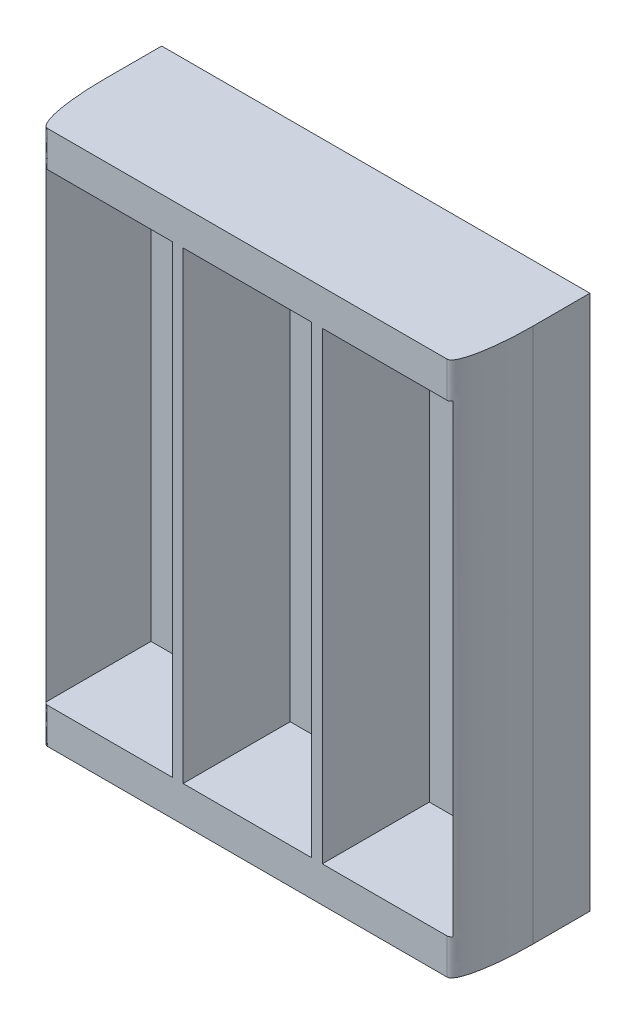
ISO-10303-21;
HEADER;
FILE_DESCRIPTION(('STEP AP214'),'2;1');
FILE_NAME('part.step','',(''),(''),'','','');
FILE_SCHEMA(('AUTOMOTIVE_DESIGN { 1 0 10303 214 1 1 1 1 }'));
ENDSEC;
DATA;
#1=APPLICATION_CONTEXT('core data for automotive mechanical design processes');
#2=APPLICATION_PROTOCOL_DEFINITION('international standard','automotive_design',2000,#1);
#3=PRODUCT_CONTEXT('',#1,'mechanical');
#4=PRODUCT('Part','Part','',(#3));
#5=PRODUCT_RELATED_PRODUCT_CATEGORY('part','',(#4));
#6=PRODUCT_DEFINITION_FORMATION('','',#4);
#7=PRODUCT_DEFINITION_CONTEXT('part definition',#1,'design');
#8=PRODUCT_DEFINITION('design','',#6,#7);
#9=PRODUCT_DEFINITION_SHAPE('','',#8);
#10=(LENGTH_UNIT() NAMED_UNIT(*) SI_UNIT(.MILLI.,.METRE.));
#11=(NAMED_UNIT(*) PLANE_ANGLE_UNIT() SI_UNIT($,.RADIAN.));
#12=(NAMED_UNIT(*) SI_UNIT($,.STERADIAN.) SOLID_ANGLE_UNIT());
#13=UNCERTAINTY_MEASURE_WITH_UNIT(LENGTH_MEASURE(1.E-05),#10,'distance_accuracy_value','');
#14=(GEOMETRIC_REPRESENTATION_CONTEXT(3) GLOBAL_UNCERTAINTY_ASSIGNED_CONTEXT((#13)) GLOBAL_UNIT_ASSIGNED_CONTEXT((#10,
#11,#12)) REPRESENTATION_CONTEXT('',''));
#15=CARTESIAN_POINT('',(0.,0.,0.));
#16=DIRECTION('',(0.,0.,1.));
#17=DIRECTION('',(1.,0.,0.));
#18=AXIS2_PLACEMENT_3D('',#15,#16,#17);
#19=CARTESIAN_POINT('',(30.,75.,18.));
#20=DIRECTION('',(-1.,0.,0.));
#21=DIRECTION('',(0.,0.,1.));
#22=AXIS2_PLACEMENT_3D('',#19,#20,#21);
#23=PLANE('',#22);
#24=DIRECTION('',(0.,0.,-1.));
#25=VECTOR('',#24,1.);
#26=CARTESIAN_POINT('',(30.,75.,18.));
#27=LINE('',#26,#25);
#28=CARTESIAN_POINT('',(30.,75.,7.99999999999999));
#29=VERTEX_POINT('',#28);
#30=CARTESIAN_POINT('',(30.,75.,0.));
#31=VERTEX_POINT('',#30);
#32=EDGE_CURVE('E344',#29,#31,#27,.T.);
#33=ORIENTED_EDGE('',*,*,#32,.F.);
#34=CARTESIAN_POINT('',(30.,-3.75000000000002,7.99999999999999));
#35=CARTESIAN_POINT('',(30.,23.75,7.99999999999999));
#36=CARTESIAN_POINT('',(30.,51.25,7.99999999999999));
#37=CARTESIAN_POINT('',(30.,78.75,7.99999999999999));
#38=(BOUNDED_CURVE() B_SPLINE_CURVE(3,(#34,#35,#36,#37),.UNSPECIFIED.,.F.,
.F.) B_SPLINE_CURVE_WITH_KNOTS((4,4),(-0.00375,0.07875),
.UNSPECIFIED.) CURVE() GEOMETRIC_REPRESENTATION_ITEM() RATIONAL_B_SPLINE_CURVE((1.,1.,1.,1.)) REPRESENTATION_ITEM(''));
#39=CARTESIAN_POINT('',(30.,0.,7.99999999999999));
#40=VERTEX_POINT('',#39);
#41=EDGE_CURVE('E361',#29,#40,#38,.F.);
#42=ORIENTED_EDGE('',*,*,#41,.T.);
#43=DIRECTION('',(0.,0.,-1.));
#44=VECTOR('',#43,1.);
#45=CARTESIAN_POINT('',(30.,0.,18.));
#46=LINE('',#45,#44);
#47=CARTESIAN_POINT('',(30.,0.,0.));
#48=VERTEX_POINT('',#47);
#49=EDGE_CURVE('E252',#40,#48,#46,.T.);
#50=ORIENTED_EDGE('',*,*,#49,.T.);
#51=DIRECTION('',(0.,-1.,0.));
#52=VECTOR('',#51,1.);
#53=CARTESIAN_POINT('',(30.,75.,0.));
#54=LINE('',#53,#52);
#55=EDGE_CURVE('E356',#31,#48,#54,.T.);
#56=ORIENTED_EDGE('',*,*,#55,.F.);
#57=EDGE_LOOP('',(#33,#42,#50,#56));
#58=FACE_BOUND('',#57,.T.);
#59=ADVANCED_FACE('F48',(#58),#23,.F.);
#60=CARTESIAN_POINT('',(-30.,75.,0.));
#61=DIRECTION('',(0.,0.,1.));
#62=DIRECTION('',(1.,0.,0.));
#63=AXIS2_PLACEMENT_3D('',#60,#61,#62);
#64=PLANE('',#63);
#65=DIRECTION('',(-1.,0.,0.));
#66=VECTOR('',#65,1.);
#67=CARTESIAN_POINT('',(-30.,0.,0.));
#68=LINE('',#67,#66);
#69=CARTESIAN_POINT('',(-30.,0.,0.));
#70=VERTEX_POINT('',#69);
#71=EDGE_CURVE('E364',#48,#70,#68,.T.);
#72=ORIENTED_EDGE('',*,*,#71,.T.);
#73=DIRECTION('',(0.,-1.,0.));
#74=VECTOR('',#73,1.);
#75=CARTESIAN_POINT('',(-30.,75.,0.));
#76=LINE('',#75,#74);
#77=CARTESIAN_POINT('',(-30.,75.,0.));
#78=VERTEX_POINT('',#77);
#79=EDGE_CURVE('E352',#78,#70,#76,.T.);
#80=ORIENTED_EDGE('',*,*,#79,.F.);
#81=DIRECTION('',(-1.,0.,0.));
#82=VECTOR('',#81,1.);
#83=CARTESIAN_POINT('',(-30.,75.,0.));
#84=LINE('',#83,#82);
#85=EDGE_CURVE('E704',#31,#78,#84,.T.);
#86=ORIENTED_EDGE('',*,*,#85,.F.);
#87=ORIENTED_EDGE('',*,*,#55,.T.);
#88=EDGE_LOOP('',(#72,#80,#86,#87));
#89=FACE_BOUND('',#88,.T.);
#90=ADVANCED_FACE('F314',(#89),#64,.F.);
#91=CARTESIAN_POINT('',(-30.,75.,0.));
#92=DIRECTION('',(1.,0.,0.));
#93=DIRECTION('',(0.,0.,-1.));
#94=AXIS2_PLACEMENT_3D('',#91,#92,#93);
#95=PLANE('',#94);
#96=DIRECTION('',(0.,0.,1.));
#97=VECTOR('',#96,1.);
#98=CARTESIAN_POINT('',(-30.,0.,0.));
#99=LINE('',#98,#97);
#100=CARTESIAN_POINT('',(-30.,0.,8.));
#101=VERTEX_POINT('',#100);
#102=EDGE_CURVE('E345',#70,#101,#99,.T.);
#103=ORIENTED_EDGE('',*,*,#102,.T.);
#104=CARTESIAN_POINT('',(-30.,78.75,8.));
#105=CARTESIAN_POINT('',(-30.,51.25,8.));
#106=CARTESIAN_POINT('',(-30.,23.75,8.));
#107=CARTESIAN_POINT('',(-30.,-3.75000000000002,8.));
#108=(BOUNDED_CURVE() B_SPLINE_CURVE(3,(#104,#105,#106,#107),.UNSPECIFIED.,.F.,
.F.) B_SPLINE_CURVE_WITH_KNOTS((4,4),(-0.00375,0.07875),
.UNSPECIFIED.) CURVE() GEOMETRIC_REPRESENTATION_ITEM() RATIONAL_B_SPLINE_CURVE((1.,1.,1.,1.)) REPRESENTATION_ITEM(''));
#109=CARTESIAN_POINT('',(-30.,75.,8.));
#110=VERTEX_POINT('',#109);
#111=EDGE_CURVE('E12',#101,#110,#108,.F.);
#112=ORIENTED_EDGE('',*,*,#111,.T.);
#113=DIRECTION('',(0.,0.,1.));
#114=VECTOR('',#113,1.);
#115=CARTESIAN_POINT('',(-30.,75.,0.));
#116=LINE('',#115,#114);
#117=EDGE_CURVE('E670',#78,#110,#116,.T.);
#118=ORIENTED_EDGE('',*,*,#117,.F.);
#119=ORIENTED_EDGE('',*,*,#79,.T.);
#120=EDGE_LOOP('',(#103,#112,#118,#119));
#121=FACE_BOUND('',#120,.T.);
#122=ADVANCED_FACE('F303',(#121),#95,.F.);
#123=CARTESIAN_POINT('',(-30.,75.,18.));
#124=DIRECTION('',(0.,0.,-1.));
#125=DIRECTION('',(-1.,0.,0.));
#126=AXIS2_PLACEMENT_3D('',#123,#124,#125);
#127=PLANE('',#126);
#128=DIRECTION('',(0.,-1.,0.));
#129=VECTOR('',#128,1.);
#130=CARTESIAN_POINT('',(-8.99999999999999,70.,18.));
#131=LINE('',#130,#129);
#132=CARTESIAN_POINT('',(-8.99999999999999,70.,18.));
#133=VERTEX_POINT('',#132);
#134=CARTESIAN_POINT('',(-8.99999999999999,5.,18.));
#135=VERTEX_POINT('',#134);
#136=EDGE_CURVE('E579',#133,#135,#131,.T.);
#137=ORIENTED_EDGE('',*,*,#136,.F.);
#138=DIRECTION('',(-1.,0.,0.));
#139=VECTOR('',#138,1.);
#140=CARTESIAN_POINT('',(-8.99999999999999,70.,18.));
#141=LINE('',#140,#139);
#142=CARTESIAN_POINT('',(9.00000000000001,70.,18.));
#143=VERTEX_POINT('',#142);
#144=EDGE_CURVE('E233',#143,#133,#141,.T.);
#145=ORIENTED_EDGE('',*,*,#144,.F.);
#146=DIRECTION('',(0.,1.,0.));
#147=VECTOR('',#146,1.);
#148=CARTESIAN_POINT('',(9.00000000000001,70.,18.));
#149=LINE('',#148,#147);
#150=CARTESIAN_POINT('',(9.00000000000001,5.,18.));
#151=VERTEX_POINT('',#150);
#152=EDGE_CURVE('E587',#151,#143,#149,.T.);
#153=ORIENTED_EDGE('',*,*,#152,.F.);
#154=DIRECTION('',(1.,0.,0.));
#155=VECTOR('',#154,1.);
#156=CARTESIAN_POINT('',(-8.99999999999999,5.,18.));
#157=LINE('',#156,#155);
#158=EDGE_CURVE('E583',#135,#151,#157,.T.);
#159=ORIENTED_EDGE('',*,*,#158,.F.);
#160=EDGE_LOOP('',(#137,#145,#153,#159));
#161=FACE_BOUND('',#160,.T.);
#162=DIRECTION('',(1.,0.,0.));
#163=VECTOR('',#162,1.);
#164=CARTESIAN_POINT('',(-30.,0.,18.));
#165=LINE('',#164,#163);
#166=CARTESIAN_POINT('',(-28.,0.,18.));
#167=VERTEX_POINT('',#166);
#168=CARTESIAN_POINT('',(28.,0.,18.));
#169=VERTEX_POINT('',#168);
#170=EDGE_CURVE('E334',#167,#169,#165,.T.);
#171=ORIENTED_EDGE('',*,*,#170,.T.);
#172=CARTESIAN_POINT('',(28.,78.75,18.));
#173=CARTESIAN_POINT('',(28.,51.25,18.));
#174=CARTESIAN_POINT('',(28.,23.75,18.));
#175=CARTESIAN_POINT('',(28.,-3.75000000000002,18.));
#176=(BOUNDED_CURVE() B_SPLINE_CURVE(3,(#172,#173,#174,#175),.UNSPECIFIED.,.F.,
.F.) B_SPLINE_CURVE_WITH_KNOTS((4,4),(-0.00375,0.07875),
.UNSPECIFIED.) CURVE() GEOMETRIC_REPRESENTATION_ITEM() RATIONAL_B_SPLINE_CURVE((1.,1.,1.,1.)) REPRESENTATION_ITEM(''));
#177=CARTESIAN_POINT('',(28.,5.,18.));
#178=VERTEX_POINT('',#177);
#179=EDGE_CURVE('E462',#169,#178,#176,.F.);
#180=ORIENTED_EDGE('',*,*,#179,.T.);
#181=DIRECTION('',(1.,0.,0.));
#182=VECTOR('',#181,1.);
#183=CARTESIAN_POINT('',(10.5,5.,18.));
#184=LINE('',#183,#182);
#185=CARTESIAN_POINT('',(10.5,5.,18.));
#186=VERTEX_POINT('',#185);
#187=EDGE_CURVE('E625',#186,#178,#184,.T.);
#188=ORIENTED_EDGE('',*,*,#187,.F.);
#189=DIRECTION('',(0.,-1.,0.));
#190=VECTOR('',#189,1.);
#191=CARTESIAN_POINT('',(10.5,70.,18.));
#192=LINE('',#191,#190);
#193=CARTESIAN_POINT('',(10.5,70.,18.));
#194=VERTEX_POINT('',#193);
#195=EDGE_CURVE('E622',#194,#186,#192,.T.);
#196=ORIENTED_EDGE('',*,*,#195,.F.);
#197=DIRECTION('',(-1.,0.,0.));
#198=VECTOR('',#197,1.);
#199=CARTESIAN_POINT('',(10.5,70.,18.));
#200=LINE('',#199,#198);
#201=CARTESIAN_POINT('',(28.,70.,18.));
#202=VERTEX_POINT('',#201);
#203=EDGE_CURVE('E239',#202,#194,#200,.T.);
#204=ORIENTED_EDGE('',*,*,#203,.F.);
#205=CARTESIAN_POINT('',(28.,78.75,18.));
#206=CARTESIAN_POINT('',(28.,51.25,18.));
#207=CARTESIAN_POINT('',(28.,23.75,18.));
#208=CARTESIAN_POINT('',(28.,-3.75000000000002,18.));
#209=(BOUNDED_CURVE() B_SPLINE_CURVE(3,(#205,#206,#207,#208),.UNSPECIFIED.,.F.,
.F.) B_SPLINE_CURVE_WITH_KNOTS((4,4),(-0.00375,0.07875),
.UNSPECIFIED.) CURVE() GEOMETRIC_REPRESENTATION_ITEM() RATIONAL_B_SPLINE_CURVE((1.,1.,1.,1.)) REPRESENTATION_ITEM(''));
#210=CARTESIAN_POINT('',(28.,75.,18.));
#211=VERTEX_POINT('',#210);
#212=EDGE_CURVE('E506',#202,#211,#209,.F.);
#213=ORIENTED_EDGE('',*,*,#212,.T.);
#214=DIRECTION('',(1.,0.,0.));
#215=VECTOR('',#214,1.);
#216=CARTESIAN_POINT('',(-30.,75.,18.));
#217=LINE('',#216,#215);
#218=CARTESIAN_POINT('',(-28.,75.,18.));
#219=VERTEX_POINT('',#218);
#220=EDGE_CURVE('E357',#219,#211,#217,.T.);
#221=ORIENTED_EDGE('',*,*,#220,.F.);
#222=CARTESIAN_POINT('',(-28.,-3.75000000000002,18.));
#223=CARTESIAN_POINT('',(-28.,23.75,18.));
#224=CARTESIAN_POINT('',(-28.,51.25,18.));
#225=CARTESIAN_POINT('',(-28.,78.75,18.));
#226=(BOUNDED_CURVE() B_SPLINE_CURVE(3,(#222,#223,#224,#225),.UNSPECIFIED.,.F.,
.F.) B_SPLINE_CURVE_WITH_KNOTS((4,4),(-0.00375,0.07875),
.UNSPECIFIED.) CURVE() GEOMETRIC_REPRESENTATION_ITEM() RATIONAL_B_SPLINE_CURVE((1.,1.,1.,1.)) REPRESENTATION_ITEM(''));
#227=CARTESIAN_POINT('',(-28.,70.,18.));
#228=VERTEX_POINT('',#227);
#229=EDGE_CURVE('E404',#219,#228,#226,.F.);
#230=ORIENTED_EDGE('',*,*,#229,.T.);
#231=DIRECTION('',(-1.,0.,0.));
#232=VECTOR('',#231,1.);
#233=CARTESIAN_POINT('',(-28.5,70.,18.));
#234=LINE('',#233,#232);
#235=CARTESIAN_POINT('',(-10.5,70.,18.));
#236=VERTEX_POINT('',#235);
#237=EDGE_CURVE('E216',#236,#228,#234,.T.);
#238=ORIENTED_EDGE('',*,*,#237,.F.);
#239=DIRECTION('',(0.,1.,0.));
#240=VECTOR('',#239,1.);
#241=CARTESIAN_POINT('',(-10.5,70.,18.));
#242=LINE('',#241,#240);
#243=CARTESIAN_POINT('',(-10.5,5.,18.));
#244=VERTEX_POINT('',#243);
#245=EDGE_CURVE('E219',#244,#236,#242,.T.);
#246=ORIENTED_EDGE('',*,*,#245,.F.);
#247=DIRECTION('',(1.,0.,0.));
#248=VECTOR('',#247,1.);
#249=CARTESIAN_POINT('',(-28.5,5.,18.));
#250=LINE('',#249,#248);
#251=CARTESIAN_POINT('',(-28.,5.,18.));
#252=VERTEX_POINT('',#251);
#253=EDGE_CURVE('E230',#252,#244,#250,.T.);
#254=ORIENTED_EDGE('',*,*,#253,.F.);
#255=CARTESIAN_POINT('',(-28.,-3.75000000000002,18.));
#256=CARTESIAN_POINT('',(-28.,23.75,18.));
#257=CARTESIAN_POINT('',(-28.,51.25,18.));
#258=CARTESIAN_POINT('',(-28.,78.75,18.));
#259=(BOUNDED_CURVE() B_SPLINE_CURVE(3,(#255,#256,#257,#258),.UNSPECIFIED.,.F.,
.F.) B_SPLINE_CURVE_WITH_KNOTS((4,4),(-0.00375,0.07875),
.UNSPECIFIED.) CURVE() GEOMETRIC_REPRESENTATION_ITEM() RATIONAL_B_SPLINE_CURVE((1.,1.,1.,1.)) REPRESENTATION_ITEM(''));
#260=EDGE_CURVE('E441',#252,#167,#259,.F.);
#261=ORIENTED_EDGE('',*,*,#260,.T.);
#262=EDGE_LOOP('',(#171,#180,#188,#196,#204,#213,#221,#230,#238,#246,#254,#261));
#263=FACE_BOUND('',#262,.T.);
#264=ADVANCED_FACE('F313',(#161,#263),#127,.F.);
#265=CARTESIAN_POINT('',(0.,75.,0.));
#266=DIRECTION('',(0.,-1.,0.));
#267=DIRECTION('',(0.,0.,-1.));
#268=AXIS2_PLACEMENT_3D('',#265,#266,#267);
#269=PLANE('',#268);
#270=ORIENTED_EDGE('',*,*,#220,.T.);
#271=CARTESIAN_POINT('',(30.,75.,7.99999999999999));
#272=CARTESIAN_POINT('',(30.,75.,18.));
#273=CARTESIAN_POINT('',(28.,75.,18.));
#274=(BOUNDED_CURVE() B_SPLINE_CURVE(2,(#271,#272,#273),.UNSPECIFIED.,.F.,
.F.) B_SPLINE_CURVE_WITH_KNOTS((3,3),(0.,1.),
.UNSPECIFIED.) CURVE() GEOMETRIC_REPRESENTATION_ITEM() RATIONAL_B_SPLINE_CURVE((1.,
0.707106781186548,1.)) REPRESENTATION_ITEM(''));
#275=EDGE_CURVE('E517',#211,#29,#274,.F.);
#276=ORIENTED_EDGE('',*,*,#275,.T.);
#277=ORIENTED_EDGE('',*,*,#32,.T.);
#278=ORIENTED_EDGE('',*,*,#85,.T.);
#279=ORIENTED_EDGE('',*,*,#117,.T.);
#280=CARTESIAN_POINT('',(-28.,75.,18.));
#281=CARTESIAN_POINT('',(-30.,75.,18.));
#282=CARTESIAN_POINT('',(-30.,75.,8.));
#283=(BOUNDED_CURVE() B_SPLINE_CURVE(2,(#280,#281,#282),.UNSPECIFIED.,.F.,
.F.) B_SPLINE_CURVE_WITH_KNOTS((3,3),(0.,1.),
.UNSPECIFIED.) CURVE() GEOMETRIC_REPRESENTATION_ITEM() RATIONAL_B_SPLINE_CURVE((1.,
0.707106781186547,1.)) REPRESENTATION_ITEM(''));
#284=EDGE_CURVE('E383',#110,#219,#283,.F.);
#285=ORIENTED_EDGE('',*,*,#284,.T.);
#286=EDGE_LOOP('',(#270,#276,#277,#278,#279,#285));
#287=FACE_BOUND('',#286,.T.);
#288=ADVANCED_FACE('F718',(#287),#269,.F.);
#289=CARTESIAN_POINT('',(0.,0.,0.));
#290=DIRECTION('',(0.,-1.,0.));
#291=DIRECTION('',(0.,0.,-1.));
#292=AXIS2_PLACEMENT_3D('',#289,#290,#291);
#293=PLANE('',#292);
#294=ORIENTED_EDGE('',*,*,#49,.F.);
#295=CARTESIAN_POINT('',(28.,0.,18.));
#296=CARTESIAN_POINT('',(30.,0.,18.));
#297=CARTESIAN_POINT('',(30.,0.,7.99999999999999));
#298=(BOUNDED_CURVE() B_SPLINE_CURVE(2,(#295,#296,#297),.UNSPECIFIED.,.F.,
.F.) B_SPLINE_CURVE_WITH_KNOTS((3,3),(0.,1.),
.UNSPECIFIED.) CURVE() GEOMETRIC_REPRESENTATION_ITEM() RATIONAL_B_SPLINE_CURVE((1.,
0.707106781186548,1.)) REPRESENTATION_ITEM(''));
#299=EDGE_CURVE('E533',#40,#169,#298,.F.);
#300=ORIENTED_EDGE('',*,*,#299,.T.);
#301=ORIENTED_EDGE('',*,*,#170,.F.);
#302=CARTESIAN_POINT('',(-30.,0.,8.));
#303=CARTESIAN_POINT('',(-30.,0.,18.));
#304=CARTESIAN_POINT('',(-28.,0.,18.));
#305=(BOUNDED_CURVE() B_SPLINE_CURVE(2,(#302,#303,#304),.UNSPECIFIED.,.F.,
.F.) B_SPLINE_CURVE_WITH_KNOTS((3,3),(0.,1.),
.UNSPECIFIED.) CURVE() GEOMETRIC_REPRESENTATION_ITEM() RATIONAL_B_SPLINE_CURVE((1.,
0.707106781186548,1.)) REPRESENTATION_ITEM(''));
#306=EDGE_CURVE('E380',#167,#101,#305,.F.);
#307=ORIENTED_EDGE('',*,*,#306,.T.);
#308=ORIENTED_EDGE('',*,*,#102,.F.);
#309=ORIENTED_EDGE('',*,*,#71,.F.);
#310=EDGE_LOOP('',(#294,#300,#301,#307,#308,#309));
#311=FACE_BOUND('',#310,.T.);
#312=ADVANCED_FACE('F727',(#311),#293,.T.);
#313=CARTESIAN_POINT('',(10.5,70.,3.));
#314=DIRECTION('',(0.,1.,0.));
#315=DIRECTION('',(0.,0.,1.));
#316=AXIS2_PLACEMENT_3D('',#313,#314,#315);
#317=PLANE('',#316);
#318=DIRECTION('',(0.,0.,1.));
#319=VECTOR('',#318,1.);
#320=CARTESIAN_POINT('',(28.5,70.,3.));
#321=LINE('',#320,#319);
#322=CARTESIAN_POINT('',(28.5,70.,3.));
#323=VERTEX_POINT('',#322);
#324=CARTESIAN_POINT('',(28.5,70.,17.6824583655119));
#325=VERTEX_POINT('',#324);
#326=EDGE_CURVE('E653',#323,#325,#321,.T.);
#327=ORIENTED_EDGE('',*,*,#326,.T.);
#328=CARTESIAN_POINT('',(28.,70.,18.));
#329=CARTESIAN_POINT('',(30.,70.,18.));
#330=CARTESIAN_POINT('',(30.,70.,7.99999999999999));
#331=(BOUNDED_CURVE() B_SPLINE_CURVE(2,(#328,#329,#330),.UNSPECIFIED.,.F.,
.F.) B_SPLINE_CURVE_WITH_KNOTS((3,3),(0.,1.),
.UNSPECIFIED.) CURVE() GEOMETRIC_REPRESENTATION_ITEM() RATIONAL_B_SPLINE_CURVE((1.,
0.707106781186548,1.)) REPRESENTATION_ITEM(''));
#332=EDGE_CURVE('E495',#325,#202,#331,.F.);
#333=ORIENTED_EDGE('',*,*,#332,.T.);
#334=ORIENTED_EDGE('',*,*,#203,.T.);
#335=DIRECTION('',(0.,0.,1.));
#336=VECTOR('',#335,1.);
#337=CARTESIAN_POINT('',(10.5,70.,3.));
#338=LINE('',#337,#336);
#339=CARTESIAN_POINT('',(10.5,70.,3.));
#340=VERTEX_POINT('',#339);
#341=EDGE_CURVE('E643',#340,#194,#338,.T.);
#342=ORIENTED_EDGE('',*,*,#341,.F.);
#343=DIRECTION('',(-1.,0.,0.));
#344=VECTOR('',#343,1.);
#345=CARTESIAN_POINT('',(10.5,70.,3.));
#346=LINE('',#345,#344);
#347=EDGE_CURVE('E628',#323,#340,#346,.T.);
#348=ORIENTED_EDGE('',*,*,#347,.F.);
#349=EDGE_LOOP('',(#327,#333,#334,#342,#348));
#350=FACE_BOUND('',#349,.T.);
#351=ADVANCED_FACE('F733',(#350),#317,.F.);
#352=CARTESIAN_POINT('',(28.5,70.,3.));
#353=DIRECTION('',(1.,0.,0.));
#354=DIRECTION('',(0.,1.,0.));
#355=AXIS2_PLACEMENT_3D('',#352,#353,#354);
#356=PLANE('',#355);
#357=DIRECTION('',(0.,0.,1.));
#358=VECTOR('',#357,1.);
#359=CARTESIAN_POINT('',(28.5,5.,3.));
#360=LINE('',#359,#358);
#361=CARTESIAN_POINT('',(28.5,5.,3.));
#362=VERTEX_POINT('',#361);
#363=CARTESIAN_POINT('',(28.5,5.,17.6824583655185));
#364=VERTEX_POINT('',#363);
#365=EDGE_CURVE('E650',#362,#364,#360,.T.);
#366=ORIENTED_EDGE('',*,*,#365,.T.);
#367=CARTESIAN_POINT('',(28.5,78.75,17.6824583655185));
#368=CARTESIAN_POINT('',(28.5,51.25,17.6824583655185));
#369=CARTESIAN_POINT('',(28.5,23.75,17.6824583655185));
#370=CARTESIAN_POINT('',(28.5,-3.75000000000002,17.6824583655185));
#371=(BOUNDED_CURVE() B_SPLINE_CURVE(3,(#367,#368,#369,#370),.UNSPECIFIED.,.F.,
.F.) B_SPLINE_CURVE_WITH_KNOTS((4,4),(-0.00375,0.07875),
.UNSPECIFIED.) CURVE() GEOMETRIC_REPRESENTATION_ITEM() RATIONAL_B_SPLINE_CURVE((0.917094319995595,
0.917094319995595,0.917094319995595,0.917094319995595)) REPRESENTATION_ITEM(''));
#372=EDGE_CURVE('E484',#364,#325,#371,.F.);
#373=ORIENTED_EDGE('',*,*,#372,.T.);
#374=ORIENTED_EDGE('',*,*,#326,.F.);
#375=DIRECTION('',(0.,1.,0.));
#376=VECTOR('',#375,1.);
#377=CARTESIAN_POINT('',(28.5,70.,3.));
#378=LINE('',#377,#376);
#379=EDGE_CURVE('E639',#362,#323,#378,.T.);
#380=ORIENTED_EDGE('',*,*,#379,.F.);
#381=EDGE_LOOP('',(#366,#373,#374,#380));
#382=FACE_BOUND('',#381,.T.);
#383=ADVANCED_FACE('F746',(#382),#356,.F.);
#384=CARTESIAN_POINT('',(10.5,5.,3.));
#385=DIRECTION('',(0.,-1.,0.));
#386=DIRECTION('',(1.,0.,0.));
#387=AXIS2_PLACEMENT_3D('',#384,#385,#386);
#388=PLANE('',#387);
#389=ORIENTED_EDGE('',*,*,#187,.T.);
#390=CARTESIAN_POINT('',(30.,5.,7.99999999999999));
#391=CARTESIAN_POINT('',(30.,5.,18.));
#392=CARTESIAN_POINT('',(28.,5.,18.));
#393=(BOUNDED_CURVE() B_SPLINE_CURVE(2,(#390,#391,#392),.UNSPECIFIED.,.F.,
.F.) B_SPLINE_CURVE_WITH_KNOTS((3,3),(0.,1.),
.UNSPECIFIED.) CURVE() GEOMETRIC_REPRESENTATION_ITEM() RATIONAL_B_SPLINE_CURVE((1.,
0.707106781186548,1.)) REPRESENTATION_ITEM(''));
#394=EDGE_CURVE('E473',#178,#364,#393,.F.);
#395=ORIENTED_EDGE('',*,*,#394,.T.);
#396=ORIENTED_EDGE('',*,*,#365,.F.);
#397=DIRECTION('',(1.,0.,0.));
#398=VECTOR('',#397,1.);
#399=CARTESIAN_POINT('',(10.5,5.,3.));
#400=LINE('',#399,#398);
#401=CARTESIAN_POINT('',(10.5,5.,3.));
#402=VERTEX_POINT('',#401);
#403=EDGE_CURVE('E635',#402,#362,#400,.T.);
#404=ORIENTED_EDGE('',*,*,#403,.F.);
#405=DIRECTION('',(0.,0.,1.));
#406=VECTOR('',#405,1.);
#407=CARTESIAN_POINT('',(10.5,5.,3.));
#408=LINE('',#407,#406);
#409=EDGE_CURVE('E647',#402,#186,#408,.T.);
#410=ORIENTED_EDGE('',*,*,#409,.T.);
#411=EDGE_LOOP('',(#389,#395,#396,#404,#410));
#412=FACE_BOUND('',#411,.T.);
#413=ADVANCED_FACE('F753',(#412),#388,.F.);
#414=CARTESIAN_POINT('',(10.5,70.,3.));
#415=DIRECTION('',(-1.,0.,0.));
#416=DIRECTION('',(0.,-1.,0.));
#417=AXIS2_PLACEMENT_3D('',#414,#415,#416);
#418=PLANE('',#417);
#419=ORIENTED_EDGE('',*,*,#195,.T.);
#420=ORIENTED_EDGE('',*,*,#409,.F.);
#421=DIRECTION('',(0.,-1.,0.));
#422=VECTOR('',#421,1.);
#423=CARTESIAN_POINT('',(10.5,70.,3.));
#424=LINE('',#423,#422);
#425=EDGE_CURVE('E631',#340,#402,#424,.T.);
#426=ORIENTED_EDGE('',*,*,#425,.F.);
#427=ORIENTED_EDGE('',*,*,#341,.T.);
#428=EDGE_LOOP('',(#419,#420,#426,#427));
#429=FACE_BOUND('',#428,.T.);
#430=ADVANCED_FACE('F759',(#429),#418,.F.);
#431=CARTESIAN_POINT('',(0.,0.,3.));
#432=DIRECTION('',(0.,0.,-1.));
#433=DIRECTION('',(-1.,0.,0.));
#434=AXIS2_PLACEMENT_3D('',#431,#432,#433);
#435=PLANE('',#434);
#436=ORIENTED_EDGE('',*,*,#347,.T.);
#437=ORIENTED_EDGE('',*,*,#425,.T.);
#438=ORIENTED_EDGE('',*,*,#403,.T.);
#439=ORIENTED_EDGE('',*,*,#379,.T.);
#440=EDGE_LOOP('',(#436,#437,#438,#439));
#441=FACE_BOUND('',#440,.T.);
#442=ADVANCED_FACE('F728',(#441),#435,.F.);
#443=CARTESIAN_POINT('',(-8.99999999999999,70.,3.));
#444=DIRECTION('',(0.,1.,0.));
#445=DIRECTION('',(0.,0.,1.));
#446=AXIS2_PLACEMENT_3D('',#443,#444,#445);
#447=PLANE('',#446);
#448=ORIENTED_EDGE('',*,*,#144,.T.);
#449=DIRECTION('',(0.,0.,1.));
#450=VECTOR('',#449,1.);
#451=CARTESIAN_POINT('',(-8.99999999999999,70.,3.));
#452=LINE('',#451,#450);
#453=CARTESIAN_POINT('',(-8.99999999999999,70.,3.));
#454=VERTEX_POINT('',#453);
#455=EDGE_CURVE('E607',#454,#133,#452,.T.);
#456=ORIENTED_EDGE('',*,*,#455,.F.);
#457=DIRECTION('',(-1.,0.,0.));
#458=VECTOR('',#457,1.);
#459=CARTESIAN_POINT('',(-8.99999999999999,70.,3.));
#460=LINE('',#459,#458);
#461=CARTESIAN_POINT('',(9.00000000000001,70.,3.));
#462=VERTEX_POINT('',#461);
#463=EDGE_CURVE('E591',#462,#454,#460,.T.);
#464=ORIENTED_EDGE('',*,*,#463,.F.);
#465=DIRECTION('',(0.,0.,1.));
#466=VECTOR('',#465,1.);
#467=CARTESIAN_POINT('',(9.00000000000001,70.,3.));
#468=LINE('',#467,#466);
#469=EDGE_CURVE('E617',#462,#143,#468,.T.);
#470=ORIENTED_EDGE('',*,*,#469,.T.);
#471=EDGE_LOOP('',(#448,#456,#464,#470));
#472=FACE_BOUND('',#471,.T.);
#473=ADVANCED_FACE('F780',(#472),#447,.F.);
#474=CARTESIAN_POINT('',(9.00000000000001,70.,3.));
#475=DIRECTION('',(1.,0.,0.));
#476=DIRECTION('',(0.,1.,0.));
#477=AXIS2_PLACEMENT_3D('',#474,#475,#476);
#478=PLANE('',#477);
#479=ORIENTED_EDGE('',*,*,#152,.T.);
#480=ORIENTED_EDGE('',*,*,#469,.F.);
#481=DIRECTION('',(0.,1.,0.));
#482=VECTOR('',#481,1.);
#483=CARTESIAN_POINT('',(9.00000000000001,70.,3.));
#484=LINE('',#483,#482);
#485=CARTESIAN_POINT('',(9.00000000000001,5.,3.));
#486=VERTEX_POINT('',#485);
#487=EDGE_CURVE('E603',#486,#462,#484,.T.);
#488=ORIENTED_EDGE('',*,*,#487,.F.);
#489=DIRECTION('',(0.,0.,1.));
#490=VECTOR('',#489,1.);
#491=CARTESIAN_POINT('',(9.00000000000001,5.,3.));
#492=LINE('',#491,#490);
#493=EDGE_CURVE('E614',#486,#151,#492,.T.);
#494=ORIENTED_EDGE('',*,*,#493,.T.);
#495=EDGE_LOOP('',(#479,#480,#488,#494));
#496=FACE_BOUND('',#495,.T.);
#497=ADVANCED_FACE('F784',(#496),#478,.F.);
#498=CARTESIAN_POINT('',(-8.99999999999999,5.,3.));
#499=DIRECTION('',(0.,-1.,0.));
#500=DIRECTION('',(1.,0.,0.));
#501=AXIS2_PLACEMENT_3D('',#498,#499,#500);
#502=PLANE('',#501);
#503=ORIENTED_EDGE('',*,*,#158,.T.);
#504=ORIENTED_EDGE('',*,*,#493,.F.);
#505=DIRECTION('',(1.,0.,0.));
#506=VECTOR('',#505,1.);
#507=CARTESIAN_POINT('',(-8.99999999999999,5.,3.));
#508=LINE('',#507,#506);
#509=CARTESIAN_POINT('',(-8.99999999999999,5.,3.));
#510=VERTEX_POINT('',#509);
#511=EDGE_CURVE('E599',#510,#486,#508,.T.);
#512=ORIENTED_EDGE('',*,*,#511,.F.);
#513=DIRECTION('',(0.,0.,1.));
#514=VECTOR('',#513,1.);
#515=CARTESIAN_POINT('',(-8.99999999999999,5.,3.));
#516=LINE('',#515,#514);
#517=EDGE_CURVE('E611',#510,#135,#516,.T.);
#518=ORIENTED_EDGE('',*,*,#517,.T.);
#519=EDGE_LOOP('',(#503,#504,#512,#518));
#520=FACE_BOUND('',#519,.T.);
#521=ADVANCED_FACE('F789',(#520),#502,.F.);
#522=CARTESIAN_POINT('',(-8.99999999999999,70.,3.));
#523=DIRECTION('',(-1.,0.,0.));
#524=DIRECTION('',(0.,-1.,0.));
#525=AXIS2_PLACEMENT_3D('',#522,#523,#524);
#526=PLANE('',#525);
#527=ORIENTED_EDGE('',*,*,#136,.T.);
#528=ORIENTED_EDGE('',*,*,#517,.F.);
#529=DIRECTION('',(0.,-1.,0.));
#530=VECTOR('',#529,1.);
#531=CARTESIAN_POINT('',(-8.99999999999999,70.,3.));
#532=LINE('',#531,#530);
#533=EDGE_CURVE('E595',#454,#510,#532,.T.);
#534=ORIENTED_EDGE('',*,*,#533,.F.);
#535=ORIENTED_EDGE('',*,*,#455,.T.);
#536=EDGE_LOOP('',(#527,#528,#534,#535));
#537=FACE_BOUND('',#536,.T.);
#538=ADVANCED_FACE('F792',(#537),#526,.F.);
#539=CARTESIAN_POINT('',(0.,0.,3.));
#540=DIRECTION('',(0.,0.,-1.));
#541=DIRECTION('',(-1.,0.,0.));
#542=AXIS2_PLACEMENT_3D('',#539,#540,#541);
#543=PLANE('',#542);
#544=ORIENTED_EDGE('',*,*,#463,.T.);
#545=ORIENTED_EDGE('',*,*,#533,.T.);
#546=ORIENTED_EDGE('',*,*,#511,.T.);
#547=ORIENTED_EDGE('',*,*,#487,.T.);
#548=EDGE_LOOP('',(#544,#545,#546,#547));
#549=FACE_BOUND('',#548,.T.);
#550=ADVANCED_FACE('F757',(#549),#543,.F.);
#551=CARTESIAN_POINT('',(-28.5,70.,3.));
#552=DIRECTION('',(-1.,0.,0.));
#553=DIRECTION('',(0.,-1.,0.));
#554=AXIS2_PLACEMENT_3D('',#551,#552,#553);
#555=PLANE('',#554);
#556=DIRECTION('',(0.,0.,1.));
#557=VECTOR('',#556,1.);
#558=CARTESIAN_POINT('',(-28.5,70.,3.));
#559=LINE('',#558,#557);
#560=CARTESIAN_POINT('',(-28.5,70.,3.));
#561=VERTEX_POINT('',#560);
#562=CARTESIAN_POINT('',(-28.5,70.,17.6824583655185));
#563=VERTEX_POINT('',#562);
#564=EDGE_CURVE('E249',#561,#563,#559,.T.);
#565=ORIENTED_EDGE('',*,*,#564,.T.);
#566=CARTESIAN_POINT('',(-28.5,-3.75000000000002,17.6824583655185));
#567=CARTESIAN_POINT('',(-28.5,23.75,17.6824583655185));
#568=CARTESIAN_POINT('',(-28.5,51.25,17.6824583655185));
#569=CARTESIAN_POINT('',(-28.5,78.75,17.6824583655185));
#570=(BOUNDED_CURVE() B_SPLINE_CURVE(3,(#566,#567,#568,#569),.UNSPECIFIED.,.F.,
.F.) B_SPLINE_CURVE_WITH_KNOTS((4,4),(-0.00375,0.07875),
.UNSPECIFIED.) CURVE() GEOMETRIC_REPRESENTATION_ITEM() RATIONAL_B_SPLINE_CURVE((0.917094319995597,
0.917094319995597,0.917094319995597,0.917094319995597)) REPRESENTATION_ITEM(''));
#571=CARTESIAN_POINT('',(-28.5,5.,17.6824583655186));
#572=VERTEX_POINT('',#571);
#573=EDGE_CURVE('E70',#563,#572,#570,.F.);
#574=ORIENTED_EDGE('',*,*,#573,.T.);
#575=DIRECTION('',(0.,0.,1.));
#576=VECTOR('',#575,1.);
#577=CARTESIAN_POINT('',(-28.5,5.,3.));
#578=LINE('',#577,#576);
#579=CARTESIAN_POINT('',(-28.5,5.,3.));
#580=VERTEX_POINT('',#579);
#581=EDGE_CURVE('E191',#580,#572,#578,.T.);
#582=ORIENTED_EDGE('',*,*,#581,.F.);
#583=DIRECTION('',(0.,-1.,0.));
#584=VECTOR('',#583,1.);
#585=CARTESIAN_POINT('',(-28.5,70.,3.));
#586=LINE('',#585,#584);
#587=EDGE_CURVE('E195',#561,#580,#586,.T.);
#588=ORIENTED_EDGE('',*,*,#587,.F.);
#589=EDGE_LOOP('',(#565,#574,#582,#588));
#590=FACE_BOUND('',#589,.T.);
#591=ADVANCED_FACE('F193',(#590),#555,.F.);
#592=CARTESIAN_POINT('',(-28.5,70.,3.));
#593=DIRECTION('',(0.,1.,0.));
#594=DIRECTION('',(0.,0.,1.));
#595=AXIS2_PLACEMENT_3D('',#592,#593,#594);
#596=PLANE('',#595);
#597=ORIENTED_EDGE('',*,*,#237,.T.);
#598=CARTESIAN_POINT('',(-30.,70.,8.));
#599=CARTESIAN_POINT('',(-30.,70.,18.));
#600=CARTESIAN_POINT('',(-28.,70.,18.));
#601=(BOUNDED_CURVE() B_SPLINE_CURVE(2,(#598,#599,#600),.UNSPECIFIED.,.F.,
.F.) B_SPLINE_CURVE_WITH_KNOTS((3,3),(0.,1.),
.UNSPECIFIED.) CURVE() GEOMETRIC_REPRESENTATION_ITEM() RATIONAL_B_SPLINE_CURVE((1.,
0.707106781186548,1.)) REPRESENTATION_ITEM(''));
#602=EDGE_CURVE('E79',#228,#563,#601,.F.);
#603=ORIENTED_EDGE('',*,*,#602,.T.);
#604=ORIENTED_EDGE('',*,*,#564,.F.);
#605=DIRECTION('',(-1.,0.,0.));
#606=VECTOR('',#605,1.);
#607=CARTESIAN_POINT('',(-28.5,70.,3.));
#608=LINE('',#607,#606);
#609=CARTESIAN_POINT('',(-10.5,70.,3.));
#610=VERTEX_POINT('',#609);
#611=EDGE_CURVE('E201',#610,#561,#608,.T.);
#612=ORIENTED_EDGE('',*,*,#611,.F.);
#613=DIRECTION('',(0.,0.,1.));
#614=VECTOR('',#613,1.);
#615=CARTESIAN_POINT('',(-10.5,70.,3.));
#616=LINE('',#615,#614);
#617=EDGE_CURVE('E246',#610,#236,#616,.T.);
#618=ORIENTED_EDGE('',*,*,#617,.T.);
#619=EDGE_LOOP('',(#597,#603,#604,#612,#618));
#620=FACE_BOUND('',#619,.T.);
#621=ADVANCED_FACE('F262',(#620),#596,.F.);
#622=CARTESIAN_POINT('',(-10.5,70.,3.));
#623=DIRECTION('',(1.,0.,0.));
#624=DIRECTION('',(0.,1.,0.));
#625=AXIS2_PLACEMENT_3D('',#622,#623,#624);
#626=PLANE('',#625);
#627=ORIENTED_EDGE('',*,*,#245,.T.);
#628=ORIENTED_EDGE('',*,*,#617,.F.);
#629=DIRECTION('',(0.,1.,0.));
#630=VECTOR('',#629,1.);
#631=CARTESIAN_POINT('',(-10.5,70.,3.));
#632=LINE('',#631,#630);
#633=CARTESIAN_POINT('',(-10.5,5.,3.));
#634=VERTEX_POINT('',#633);
#635=EDGE_CURVE('E211',#634,#610,#632,.T.);
#636=ORIENTED_EDGE('',*,*,#635,.F.);
#637=DIRECTION('',(0.,0.,1.));
#638=VECTOR('',#637,1.);
#639=CARTESIAN_POINT('',(-10.5,5.,3.));
#640=LINE('',#639,#638);
#641=EDGE_CURVE('E200',#634,#244,#640,.T.);
#642=ORIENTED_EDGE('',*,*,#641,.T.);
#643=EDGE_LOOP('',(#627,#628,#636,#642));
#644=FACE_BOUND('',#643,.T.);
#645=ADVANCED_FACE('F272',(#644),#626,.F.);
#646=CARTESIAN_POINT('',(-28.5,5.,3.));
#647=DIRECTION('',(0.,-1.,0.));
#648=DIRECTION('',(1.,0.,0.));
#649=AXIS2_PLACEMENT_3D('',#646,#647,#648);
#650=PLANE('',#649);
#651=ORIENTED_EDGE('',*,*,#581,.T.);
#652=CARTESIAN_POINT('',(-28.,5.,18.));
#653=CARTESIAN_POINT('',(-30.,5.,18.));
#654=CARTESIAN_POINT('',(-30.,5.,8.));
#655=(BOUNDED_CURVE() B_SPLINE_CURVE(2,(#652,#653,#654),.UNSPECIFIED.,.F.,
.F.) B_SPLINE_CURVE_WITH_KNOTS((3,3),(0.,1.),
.UNSPECIFIED.) CURVE() GEOMETRIC_REPRESENTATION_ITEM() RATIONAL_B_SPLINE_CURVE((1.,
0.707106781186548,1.)) REPRESENTATION_ITEM(''));
#656=EDGE_CURVE('E63',#572,#252,#655,.F.);
#657=ORIENTED_EDGE('',*,*,#656,.T.);
#658=ORIENTED_EDGE('',*,*,#253,.T.);
#659=ORIENTED_EDGE('',*,*,#641,.F.);
#660=DIRECTION('',(1.,0.,0.));
#661=VECTOR('',#660,1.);
#662=CARTESIAN_POINT('',(-28.5,5.,3.));
#663=LINE('',#662,#661);
#664=EDGE_CURVE('E204',#580,#634,#663,.T.);
#665=ORIENTED_EDGE('',*,*,#664,.F.);
#666=EDGE_LOOP('',(#651,#657,#658,#659,#665));
#667=FACE_BOUND('',#666,.T.);
#668=ADVANCED_FACE('F205',(#667),#650,.F.);
#669=CARTESIAN_POINT('',(0.,0.,3.));
#670=DIRECTION('',(0.,0.,1.));
#671=DIRECTION('',(1.,0.,0.));
#672=AXIS2_PLACEMENT_3D('',#669,#670,#671);
#673=PLANE('',#672);
#674=ORIENTED_EDGE('',*,*,#587,.T.);
#675=ORIENTED_EDGE('',*,*,#664,.T.);
#676=ORIENTED_EDGE('',*,*,#635,.T.);
#677=ORIENTED_EDGE('',*,*,#611,.T.);
#678=EDGE_LOOP('',(#674,#675,#676,#677));
#679=FACE_BOUND('',#678,.T.);
#680=ADVANCED_FACE('F213',(#679),#673,.T.);
#681=CARTESIAN_POINT('',(30.,78.75,7.99999999999999));
#682=CARTESIAN_POINT('',(30.,51.25,7.99999999999999));
#683=CARTESIAN_POINT('',(30.,23.75,7.99999999999999));
#684=CARTESIAN_POINT('',(30.,-3.75000000000002,7.99999999999999));
#685=CARTESIAN_POINT('',(30.,78.75,18.));
#686=CARTESIAN_POINT('',(30.,51.25,18.));
#687=CARTESIAN_POINT('',(30.,23.75,18.));
#688=CARTESIAN_POINT('',(30.,-3.75000000000002,18.));
#689=CARTESIAN_POINT('',(28.,78.75,18.));
#690=CARTESIAN_POINT('',(28.,51.25,18.));
#691=CARTESIAN_POINT('',(28.,23.75,18.));
#692=CARTESIAN_POINT('',(28.,-3.75000000000002,18.));
#693=(BOUNDED_SURFACE() B_SPLINE_SURFACE(2,3,((#681,#682,#683,#684),(#685,#686,#687,#688),(#689,
#690,#691,#692)),.UNSPECIFIED.,.F.,.F.,.F.) B_SPLINE_SURFACE_WITH_KNOTS((3,3),(4,4),(0.,1.),
(-0.00375,0.07875),
.UNSPECIFIED.) GEOMETRIC_REPRESENTATION_ITEM() RATIONAL_B_SPLINE_SURFACE(((1.,1.,1.,1.),
(0.707106781186548,0.707106781186548,0.707106781186548,0.707106781186548),(1.,1.,1.,1.))) REPRESENTATION_ITEM('') SURFACE());
#694=ORIENTED_EDGE('',*,*,#394,.F.);
#695=ORIENTED_EDGE('',*,*,#179,.F.);
#696=ORIENTED_EDGE('',*,*,#299,.F.);
#697=ORIENTED_EDGE('',*,*,#41,.F.);
#698=ORIENTED_EDGE('',*,*,#275,.F.);
#699=ORIENTED_EDGE('',*,*,#212,.F.);
#700=ORIENTED_EDGE('',*,*,#332,.F.);
#701=ORIENTED_EDGE('',*,*,#372,.F.);
#702=EDGE_LOOP('',(#694,#695,#696,#697,#698,#699,#700,#701));
#703=FACE_BOUND('',#702,.T.);
#704=ADVANCED_FACE('F323',(#703),#693,.T.);
#705=CARTESIAN_POINT('',(-28.,78.75,18.));
#706=CARTESIAN_POINT('',(-28.,51.25,18.));
#707=CARTESIAN_POINT('',(-28.,23.75,18.));
#708=CARTESIAN_POINT('',(-28.,-3.75000000000002,18.));
#709=CARTESIAN_POINT('',(-30.,78.75,18.));
#710=CARTESIAN_POINT('',(-30.,51.25,18.));
#711=CARTESIAN_POINT('',(-30.,23.75,18.));
#712=CARTESIAN_POINT('',(-30.,-3.75000000000002,18.));
#713=CARTESIAN_POINT('',(-30.,78.75,8.));
#714=CARTESIAN_POINT('',(-30.,51.25,8.));
#715=CARTESIAN_POINT('',(-30.,23.75,8.));
#716=CARTESIAN_POINT('',(-30.,-3.75000000000002,8.));
#717=(BOUNDED_SURFACE() B_SPLINE_SURFACE(2,3,((#705,#706,#707,#708),(#709,#710,#711,#712),(#713,
#714,#715,#716)),.UNSPECIFIED.,.F.,.F.,.F.) B_SPLINE_SURFACE_WITH_KNOTS((3,3),(4,4),(0.,1.),
(-0.00375,0.07875),
.UNSPECIFIED.) GEOMETRIC_REPRESENTATION_ITEM() RATIONAL_B_SPLINE_SURFACE(((1.,1.,1.,1.),
(0.707106781186548,0.707106781186548,0.707106781186548,0.707106781186548),(1.,1.,1.,1.))) REPRESENTATION_ITEM('') SURFACE());
#718=ORIENTED_EDGE('',*,*,#284,.F.);
#719=ORIENTED_EDGE('',*,*,#111,.F.);
#720=ORIENTED_EDGE('',*,*,#306,.F.);
#721=ORIENTED_EDGE('',*,*,#260,.F.);
#722=ORIENTED_EDGE('',*,*,#656,.F.);
#723=ORIENTED_EDGE('',*,*,#573,.F.);
#724=ORIENTED_EDGE('',*,*,#602,.F.);
#725=ORIENTED_EDGE('',*,*,#229,.F.);
#726=EDGE_LOOP('',(#718,#719,#720,#721,#722,#723,#724,#725));
#727=FACE_BOUND('',#726,.T.);
#728=ADVANCED_FACE('F51',(#727),#717,.T.);
#729=CLOSED_SHELL('',(#59,#90,#122,#264,#288,#312,#351,#383,#413,#430,#442,#473,#497,#521,#538,
#550,#591,#621,#645,#668,#680,#704,#728));
#730=MANIFOLD_SOLID_BREP('B2',#729);
#731=ADVANCED_BREP_SHAPE_REPRESENTATION('',(#18,#730),#14);
#732=SHAPE_DEFINITION_REPRESENTATION(#9,#731);
ENDSEC;
END-ISO-10303-21;
